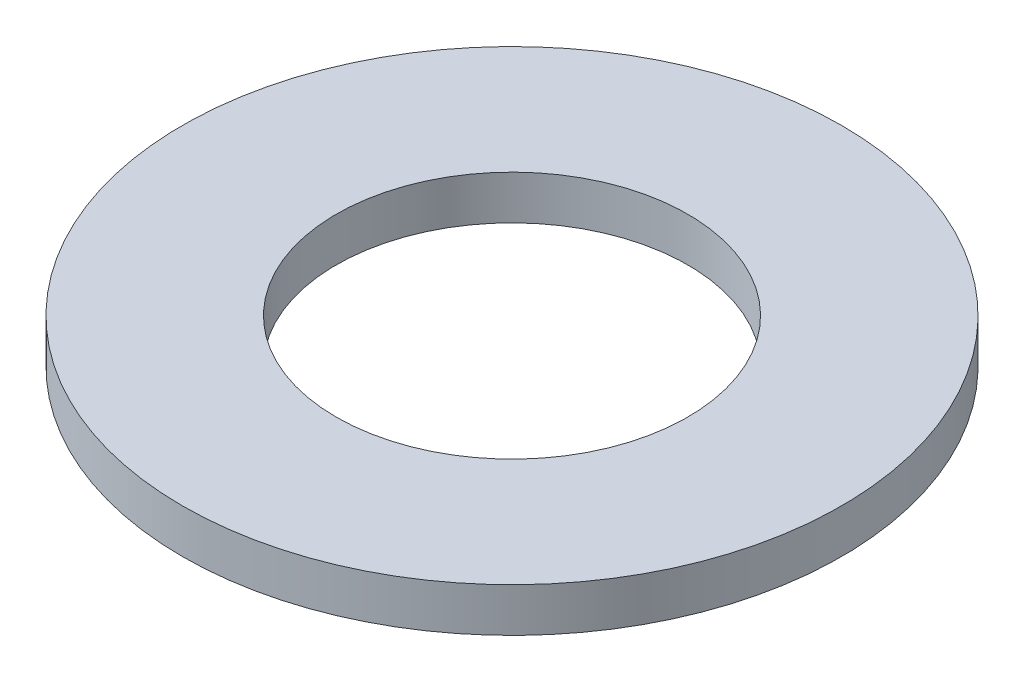
ISO-10303-21;
HEADER;
FILE_DESCRIPTION(('STEP AP214'),'2;1');
FILE_NAME('part.step','',(''),(''),'','','');
FILE_SCHEMA(('AUTOMOTIVE_DESIGN { 1 0 10303 214 1 1 1 1 }'));
ENDSEC;
DATA;
#1=APPLICATION_CONTEXT('core data for automotive mechanical design processes');
#2=APPLICATION_PROTOCOL_DEFINITION('international standard','automotive_design',2000,#1);
#3=PRODUCT_CONTEXT('',#1,'mechanical');
#4=PRODUCT('Part','Part','',(#3));
#5=PRODUCT_RELATED_PRODUCT_CATEGORY('part','',(#4));
#6=PRODUCT_DEFINITION_FORMATION('','',#4);
#7=PRODUCT_DEFINITION_CONTEXT('part definition',#1,'design');
#8=PRODUCT_DEFINITION('design','',#6,#7);
#9=PRODUCT_DEFINITION_SHAPE('','',#8);
#10=(LENGTH_UNIT() NAMED_UNIT(*) SI_UNIT(.MILLI.,.METRE.));
#11=(NAMED_UNIT(*) PLANE_ANGLE_UNIT() SI_UNIT($,.RADIAN.));
#12=(NAMED_UNIT(*) SI_UNIT($,.STERADIAN.) SOLID_ANGLE_UNIT());
#13=UNCERTAINTY_MEASURE_WITH_UNIT(LENGTH_MEASURE(1.E-05),#10,'distance_accuracy_value','');
#14=(GEOMETRIC_REPRESENTATION_CONTEXT(3) GLOBAL_UNCERTAINTY_ASSIGNED_CONTEXT((#13)) GLOBAL_UNIT_ASSIGNED_CONTEXT((#10,
#11,#12)) REPRESENTATION_CONTEXT('',''));
#15=CARTESIAN_POINT('',(0.,0.,0.));
#16=DIRECTION('',(0.,0.,1.));
#17=DIRECTION('',(1.,0.,0.));
#18=AXIS2_PLACEMENT_3D('',#15,#16,#17);
#19=CARTESIAN_POINT('',(0.,0.4,0.));
#20=DIRECTION('',(0.,1.,0.));
#21=DIRECTION('',(0.,0.,1.));
#22=AXIS2_PLACEMENT_3D('',#19,#20,#21);
#23=PLANE('',#22);
#24=CARTESIAN_POINT('',(0.,0.4,0.));
#25=DIRECTION('',(0.,1.,0.));
#26=DIRECTION('',(0.,0.,1.));
#27=AXIS2_PLACEMENT_3D('',#24,#25,#26);
#28=CIRCLE('',#27,3.);
#29=CARTESIAN_POINT('',(0.,0.4,3.));
#30=VERTEX_POINT('',#29);
#31=EDGE_CURVE('E10',#30,#30,#28,.T.);
#32=ORIENTED_EDGE('',*,*,#31,.T.);
#33=EDGE_LOOP('',(#32));
#34=FACE_BOUND('',#33,.T.);
#35=CARTESIAN_POINT('',(0.,0.4,0.));
#36=DIRECTION('',(0.,1.,0.));
#37=DIRECTION('',(0.,0.,1.));
#38=AXIS2_PLACEMENT_3D('',#35,#36,#37);
#39=CIRCLE('',#38,1.6);
#40=CARTESIAN_POINT('',(0.,0.4,1.6));
#41=VERTEX_POINT('',#40);
#42=EDGE_CURVE('E48',#41,#41,#39,.T.);
#43=ORIENTED_EDGE('',*,*,#42,.F.);
#44=EDGE_LOOP('',(#43));
#45=FACE_BOUND('',#44,.T.);
#46=ADVANCED_FACE('F37',(#34,#45),#23,.T.);
#47=CARTESIAN_POINT('',(0.,0.,0.));
#48=DIRECTION('',(0.,1.,0.));
#49=DIRECTION('',(0.,0.,1.));
#50=AXIS2_PLACEMENT_3D('',#47,#48,#49);
#51=PLANE('',#50);
#52=CARTESIAN_POINT('',(0.,0.,0.));
#53=DIRECTION('',(0.,1.,0.));
#54=DIRECTION('',(0.,0.,1.));
#55=AXIS2_PLACEMENT_3D('',#52,#53,#54);
#56=CIRCLE('',#55,3.);
#57=CARTESIAN_POINT('',(0.,0.,3.));
#58=VERTEX_POINT('',#57);
#59=EDGE_CURVE('E41',#58,#58,#56,.T.);
#60=ORIENTED_EDGE('',*,*,#59,.F.);
#61=EDGE_LOOP('',(#60));
#62=FACE_BOUND('',#61,.T.);
#63=CARTESIAN_POINT('',(0.,0.,0.));
#64=DIRECTION('',(0.,1.,0.));
#65=DIRECTION('',(0.,0.,1.));
#66=AXIS2_PLACEMENT_3D('',#63,#64,#65);
#67=CIRCLE('',#66,1.6);
#68=CARTESIAN_POINT('',(0.,0.,1.6));
#69=VERTEX_POINT('',#68);
#70=EDGE_CURVE('E50',#69,#69,#67,.T.);
#71=ORIENTED_EDGE('',*,*,#70,.T.);
#72=EDGE_LOOP('',(#71));
#73=FACE_BOUND('',#72,.T.);
#74=ADVANCED_FACE('F60',(#62,#73),#51,.F.);
#75=CARTESIAN_POINT('',(0.,0.4,0.));
#76=DIRECTION('',(0.,-1.,0.));
#77=DIRECTION('',(0.,0.,-1.));
#78=AXIS2_PLACEMENT_3D('',#75,#76,#77);
#79=CYLINDRICAL_SURFACE('',#78,3.);
#80=ORIENTED_EDGE('',*,*,#31,.F.);
#81=EDGE_LOOP('',(#80));
#82=FACE_BOUND('',#81,.T.);
#83=ORIENTED_EDGE('',*,*,#59,.T.);
#84=EDGE_LOOP('',(#83));
#85=FACE_BOUND('',#84,.T.);
#86=ADVANCED_FACE('F39',(#82,#85),#79,.T.);
#87=CARTESIAN_POINT('',(0.,0.4,0.));
#88=DIRECTION('',(0.,-1.,0.));
#89=DIRECTION('',(0.,0.,-1.));
#90=AXIS2_PLACEMENT_3D('',#87,#88,#89);
#91=CYLINDRICAL_SURFACE('',#90,1.6);
#92=ORIENTED_EDGE('',*,*,#42,.T.);
#93=EDGE_LOOP('',(#92));
#94=FACE_BOUND('',#93,.T.);
#95=ORIENTED_EDGE('',*,*,#70,.F.);
#96=EDGE_LOOP('',(#95));
#97=FACE_BOUND('',#96,.T.);
#98=ADVANCED_FACE('F56',(#94,#97),#91,.F.);
#99=CLOSED_SHELL('',(#46,#74,#86,#98));
#100=MANIFOLD_SOLID_BREP('B2',#99);
#101=ADVANCED_BREP_SHAPE_REPRESENTATION('',(#18,#100),#14);
#102=SHAPE_DEFINITION_REPRESENTATION(#9,#101);
ENDSEC;
END-ISO-10303-21;
